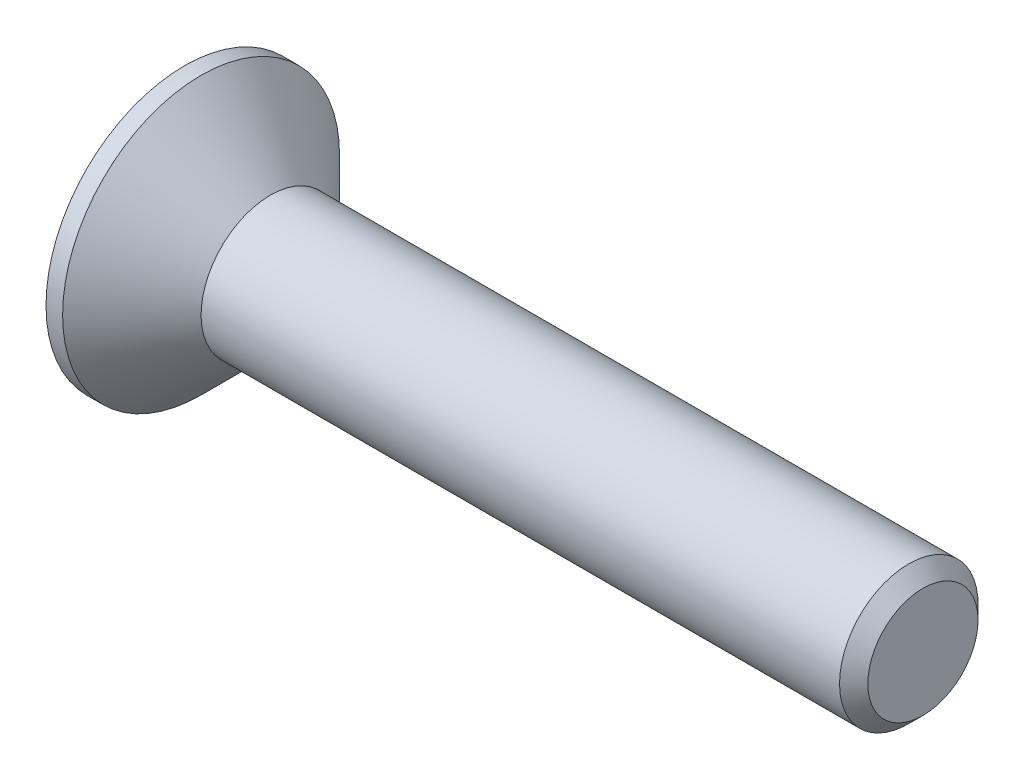
ISO-10303-21;
HEADER;
FILE_DESCRIPTION(('STEP AP214'),'2;1');
FILE_NAME('part.step','',(''),(''),'','','');
FILE_SCHEMA(('AUTOMOTIVE_DESIGN { 1 0 10303 214 1 1 1 1 }'));
ENDSEC;
DATA;
#1=APPLICATION_CONTEXT('core data for automotive mechanical design processes');
#2=APPLICATION_PROTOCOL_DEFINITION('international standard','automotive_design',2000,#1);
#3=PRODUCT_CONTEXT('',#1,'mechanical');
#4=PRODUCT('Part','Part','',(#3));
#5=PRODUCT_RELATED_PRODUCT_CATEGORY('part','',(#4));
#6=PRODUCT_DEFINITION_FORMATION('','',#4);
#7=PRODUCT_DEFINITION_CONTEXT('part definition',#1,'design');
#8=PRODUCT_DEFINITION('design','',#6,#7);
#9=PRODUCT_DEFINITION_SHAPE('','',#8);
#10=(LENGTH_UNIT() NAMED_UNIT(*) SI_UNIT(.MILLI.,.METRE.));
#11=(NAMED_UNIT(*) PLANE_ANGLE_UNIT() SI_UNIT($,.RADIAN.));
#12=(NAMED_UNIT(*) SI_UNIT($,.STERADIAN.) SOLID_ANGLE_UNIT());
#13=UNCERTAINTY_MEASURE_WITH_UNIT(LENGTH_MEASURE(1.E-05),#10,'distance_accuracy_value','');
#14=(GEOMETRIC_REPRESENTATION_CONTEXT(3) GLOBAL_UNCERTAINTY_ASSIGNED_CONTEXT((#13)) GLOBAL_UNIT_ASSIGNED_CONTEXT((#10,
#11,#12)) REPRESENTATION_CONTEXT('',''));
#15=CARTESIAN_POINT('',(0.,0.,0.));
#16=DIRECTION('',(0.,0.,1.));
#17=DIRECTION('',(1.,0.,0.));
#18=AXIS2_PLACEMENT_3D('',#15,#16,#17);
#19=CARTESIAN_POINT('',(1.04599999917809,0.,0.));
#20=DIRECTION('',(-1.,0.,0.));
#21=DIRECTION('',(0.,0.,1.));
#22=AXIS2_PLACEMENT_3D('',#19,#20,#21);
#23=CONICAL_SURFACE('',#22,1.16162874121528,1.04719754989847);
#24=CARTESIAN_POINT('',(1.71666666756209,-1.13686837721616E-10,0.));
#25=VERTEX_POINT('',#24);
#26=VERTEX_LOOP('',#25);
#27=FACE_BOUND('',#26,.T.);
#28=CARTESIAN_POINT('',(1.04999999915816,0.99999999988541,-0.577350269477191));
#29=CARTESIAN_POINT('',(1.06465222655813,0.956056056027435,-0.602721317150959));
#30=CARTESIAN_POINT('',(1.07797766057508,0.911732788715829,-0.628311367406472));
#31=CARTESIAN_POINT('',(1.10123680546114,0.822318826403541,-0.679934542574106));
#32=CARTESIAN_POINT('',(1.11116228902451,0.777226543207014,-0.705968584431704));
#33=CARTESIAN_POINT('',(1.1266120197586,0.687600782865967,-0.757714041302104));
#34=CARTESIAN_POINT('',(1.13223910544002,0.643081091930934,-0.783417496843638));
#35=CARTESIAN_POINT('',(1.1389554151745,0.553832339498311,-0.834945288082512));
#36=CARTESIAN_POINT('',(1.14005020224715,0.509103602173087,-0.860769436618843));
#37=CARTESIAN_POINT('',(1.13776685413357,0.42553275490695,-0.909019087785041));
#38=CARTESIAN_POINT('',(1.13494935659067,0.386678104479406,-0.931451830668418));
#39=CARTESIAN_POINT('',(1.12602134881308,0.309221928999102,-0.976171174432198));
#40=CARTESIAN_POINT('',(1.1199077917733,0.270620671646619,-0.998457620755773));
#41=CARTESIAN_POINT('',(1.10462508245671,0.193004929140783,-1.04326909058492));
#42=CARTESIAN_POINT('',(1.09539117799923,0.154000262351649,-1.06578844545527));
#43=CARTESIAN_POINT('',(1.07443411865222,0.0765725151241327,-1.11049137615979));
#44=CARTESIAN_POINT('',(1.06271588467684,0.0381484435119863,-1.13267552424842));
#45=CARTESIAN_POINT('',(1.04999999903347,2.13019461317065E-10,-1.15470053825626));
#46=B_SPLINE_CURVE_WITH_KNOTS('',3,(#28,#29,#30,#31,#32,#33,#34,#35,#36,#37,#38,#39,#40,#41,#42,
#43,#44,#45),.UNSPECIFIED.,.F.,.F.,(4,2,2,2,2,2,2,2,4),(0.,0.158508005804988,0.31739690857287,
0.472353803151371,0.62712044453655,0.76185389126852,0.896712096716049,1.03456081093649,
1.17213898632063),.UNSPECIFIED.);
#47=CARTESIAN_POINT('',(1.04999999900237,1.,-0.577350269051391));
#48=VERTEX_POINT('',#47);
#49=CARTESIAN_POINT('',(1.04999999904228,0.,-1.15470053824102));
#50=VERTEX_POINT('',#49);
#51=EDGE_CURVE('E81',#48,#50,#46,.T.);
#52=ORIENTED_EDGE('',*,*,#51,.T.);
#53=CARTESIAN_POINT('',(1.04999999915816,-3.06333742717169E-10,-1.1547005384238));
#54=CARTESIAN_POINT('',(1.06465222655813,-0.0439439440414311,-1.1293294905372));
#55=CARTESIAN_POINT('',(1.07797766057508,-0.0882672113026287,-1.10373944019437));
#56=CARTESIAN_POINT('',(1.10123680546114,-0.177681173577958,-1.05211626496273));
#57=CARTESIAN_POINT('',(1.11116228902451,-0.222773456788089,-1.02608222312869));
#58=CARTESIAN_POINT('',(1.1266120197586,-0.31239921713881,-0.974336766275047));
#59=CARTESIAN_POINT('',(1.13223910544002,-0.35691890807034,-0.948633310727445));
#60=CARTESIAN_POINT('',(1.1389554151745,-0.446167660500418,-0.897105519484162));
#61=CARTESIAN_POINT('',(1.14005020224715,-0.490896397826595,-0.871281370949482));
#62=CARTESIAN_POINT('',(1.13776685413357,-0.574467245093328,-0.823031719784317));
#63=CARTESIAN_POINT('',(1.13494935659067,-0.61332189552067,-0.800598976900589));
#64=CARTESIAN_POINT('',(1.12602134881307,-0.690778071000823,-0.75587963313655));
#65=CARTESIAN_POINT('',(1.1199077917733,-0.72937932835336,-0.733593186813067));
#66=CARTESIAN_POINT('',(1.10462508245671,-0.806995070859239,-0.688781716983995));
#67=CARTESIAN_POINT('',(1.09539117799923,-0.845999737648361,-0.666262362113631));
#68=CARTESIAN_POINT('',(1.07443411865221,-0.923427484875856,-0.621559431409065));
#69=CARTESIAN_POINT('',(1.06271588467684,-0.961851556487991,-0.599375283320425));
#70=CARTESIAN_POINT('',(1.04999999903347,-0.99999999978698,-0.577350269312614));
#71=B_SPLINE_CURVE_WITH_KNOTS('',3,(#53,#54,#55,#56,#57,#58,#59,#60,#61,#62,#63,#64,#65,#66,#67,
#68,#69,#70),.UNSPECIFIED.,.F.,.F.,(4,2,2,2,2,2,2,2,4),(0.,0.158508005804988,0.31739690857287,
0.472353803151372,0.627120444536551,0.76185389126852,0.896712096716049,1.03456081093649,
1.17213898632063),.UNSPECIFIED.);
#72=CARTESIAN_POINT('',(1.04999999904228,-0.999999999880284,-0.577350269120509));
#73=VERTEX_POINT('',#72);
#74=EDGE_CURVE('E83',#50,#73,#71,.T.);
#75=ORIENTED_EDGE('',*,*,#74,.T.);
#76=CARTESIAN_POINT('',(1.04999999915816,-1.00000000019174,-0.577350268946607));
#77=CARTESIAN_POINT('',(1.06465222655813,-1.00000000006887,-0.526608173386239));
#78=CARTESIAN_POINT('',(1.07797766057508,-1.00000000001846,-0.475428072787903));
#79=CARTESIAN_POINT('',(1.10123680546114,-0.999999999981499,-0.37218172238862));
#80=CARTESIAN_POINT('',(1.11116228902451,-0.999999999995102,-0.320113638696986));
#81=CARTESIAN_POINT('',(1.1266120197586,-1.00000000000478,-0.216622724972944));
#82=CARTESIAN_POINT('',(1.13223910544002,-1.00000000000127,-0.165215813883806));
#83=CARTESIAN_POINT('',(1.1389554151745,-0.999999999998728,-0.0621602314016498));
#84=CARTESIAN_POINT('',(1.14005020224715,-0.999999999999681,-0.0105119343306385));
#85=CARTESIAN_POINT('',(1.13776685413357,-1.00000000000028,0.085987368000724));
#86=CARTESIAN_POINT('',(1.13494935659067,-1.00000000000007,0.13085285376783));
#87=CARTESIAN_POINT('',(1.12602134881308,-0.999999999999925,0.220291541295648));
#88=CARTESIAN_POINT('',(1.1199077917733,-0.999999999999978,0.264864433942707));
#89=CARTESIAN_POINT('',(1.10462508245671,-1.00000000000002,0.354487373600926));
#90=CARTESIAN_POINT('',(1.09539117799923,-1.00000000000001,0.399526083341636));
#91=CARTESIAN_POINT('',(1.07443411865221,-0.999999999999989,0.488931944750729));
#92=CARTESIAN_POINT('',(1.06271588467684,-0.999999999999978,0.533300240927991));
#93=CARTESIAN_POINT('',(1.04999999903347,-1.,0.577350268943651));
#94=B_SPLINE_CURVE_WITH_KNOTS('',3,(#76,#77,#78,#79,#80,#81,#82,#83,#84,#85,#86,#87,#88,#89,#90,
#91,#92,#93),.UNSPECIFIED.,.F.,.F.,(4,2,2,2,2,2,2,2,4),(0.,0.158508005804988,0.31739690857287,
0.472353803151372,0.627120444536551,0.761853891268521,0.89671209671605,1.03456081093649,
1.17213898632064),.UNSPECIFIED.);
#95=CARTESIAN_POINT('',(1.04999999904228,-0.999999999880285,0.577350269120508));
#96=VERTEX_POINT('',#95);
#97=EDGE_CURVE('E104',#73,#96,#94,.T.);
#98=ORIENTED_EDGE('',*,*,#97,.T.);
#99=CARTESIAN_POINT('',(1.04999999915816,-0.999999999885411,0.57735026947719));
#100=CARTESIAN_POINT('',(1.06465222655813,-0.956056056027436,0.602721317150959));
#101=CARTESIAN_POINT('',(1.07797766057508,-0.91173278871583,0.628311367406472));
#102=CARTESIAN_POINT('',(1.10123680546114,-0.822318826403542,0.679934542574106));
#103=CARTESIAN_POINT('',(1.11116228902451,-0.777226543207014,0.705968584431704));
#104=CARTESIAN_POINT('',(1.1266120197586,-0.687600782865967,0.757714041302104));
#105=CARTESIAN_POINT('',(1.13223910544002,-0.643081091930935,0.783417496843638));
#106=CARTESIAN_POINT('',(1.1389554151745,-0.553832339498312,0.834945288082513));
#107=CARTESIAN_POINT('',(1.14005020224715,-0.509103602173087,0.860769436618843));
#108=CARTESIAN_POINT('',(1.13776685413357,-0.42553275490695,0.909019087785041));
#109=CARTESIAN_POINT('',(1.13494935659067,-0.386678104479406,0.931451830668419));
#110=CARTESIAN_POINT('',(1.12602134881308,-0.309221928999103,0.976171174432198));
#111=CARTESIAN_POINT('',(1.1199077917733,-0.270620671646619,0.998457620755774));
#112=CARTESIAN_POINT('',(1.10462508245671,-0.193004929140783,1.04326909058492));
#113=CARTESIAN_POINT('',(1.09539117799923,-0.15400026235165,1.06578844545527));
#114=CARTESIAN_POINT('',(1.07443411865222,-0.0765725151241331,1.11049137615979));
#115=CARTESIAN_POINT('',(1.06271588467684,-0.0381484435119867,1.13267552424842));
#116=CARTESIAN_POINT('',(1.04999999903347,-2.13019774962938E-10,1.15470053825626));
#117=B_SPLINE_CURVE_WITH_KNOTS('',3,(#99,#100,#101,#102,#103,#104,#105,#106,#107,#108,#109,#110,
#111,#112,#113,#114,#115,#116),.UNSPECIFIED.,.F.,.F.,(4,2,2,2,2,2,2,2,4),(0.,0.158508005804988,
0.317396908572871,0.472353803151372,0.627120444536551,0.761853891268521,0.89671209671605,
1.03456081093649,1.17213898632064),.UNSPECIFIED.);
#118=CARTESIAN_POINT('',(1.04999999904228,0.,1.15470053824102));
#119=VERTEX_POINT('',#118);
#120=EDGE_CURVE('E109',#96,#119,#117,.T.);
#121=ORIENTED_EDGE('',*,*,#120,.T.);
#122=CARTESIAN_POINT('',(1.04999999915816,3.06333275139649E-10,1.1547005384238));
#123=CARTESIAN_POINT('',(1.06465222655813,0.0439439440414307,1.1293294905372));
#124=CARTESIAN_POINT('',(1.07797766057508,0.0882672113026281,1.10373944019437));
#125=CARTESIAN_POINT('',(1.10123680546114,0.177681173577957,1.05211626496273));
#126=CARTESIAN_POINT('',(1.11116228902451,0.222773456788088,1.02608222312869));
#127=CARTESIAN_POINT('',(1.1266120197586,0.31239921713881,0.974336766275047));
#128=CARTESIAN_POINT('',(1.13223910544002,0.356918908070339,0.948633310727444));
#129=CARTESIAN_POINT('',(1.1389554151745,0.446167660500417,0.897105519484162));
#130=CARTESIAN_POINT('',(1.14005020224715,0.490896397826594,0.871281370949481));
#131=CARTESIAN_POINT('',(1.13776685413357,0.574467245093327,0.823031719784317));
#132=CARTESIAN_POINT('',(1.13494935659067,0.613321895520669,0.800598976900588));
#133=CARTESIAN_POINT('',(1.12602134881308,0.690778071000823,0.755879633136549));
#134=CARTESIAN_POINT('',(1.1199077917733,0.729379328353359,0.733593186813066));
#135=CARTESIAN_POINT('',(1.10462508245671,0.806995070859239,0.688781716983994));
#136=CARTESIAN_POINT('',(1.09539117799923,0.845999737648361,0.666262362113629));
#137=CARTESIAN_POINT('',(1.07443411865222,0.923427484875856,0.621559431409063));
#138=CARTESIAN_POINT('',(1.06271588467684,0.961851556487991,0.599375283320423));
#139=CARTESIAN_POINT('',(1.04999999903347,0.99999999978698,0.577350269312612));
#140=B_SPLINE_CURVE_WITH_KNOTS('',3,(#122,#123,#124,#125,#126,#127,#128,#129,#130,#131,#132,
#133,#134,#135,#136,#137,#138,#139),.UNSPECIFIED.,.F.,.F.,(4,2,2,2,2,2,2,2,4),(0.,
0.158508005804988,0.31739690857287,0.472353803151372,0.627120444536551,0.761853891268521,
0.89671209671605,1.03456081093649,1.17213898632064),.UNSPECIFIED.);
#141=CARTESIAN_POINT('',(1.04999999904228,0.999999999880285,0.577350269120507));
#142=VERTEX_POINT('',#141);
#143=EDGE_CURVE('E114',#119,#142,#140,.T.);
#144=ORIENTED_EDGE('',*,*,#143,.T.);
#145=CARTESIAN_POINT('',(1.04999999915816,1.00000000019174,0.577350268946605));
#146=CARTESIAN_POINT('',(1.06465222655813,1.00000000006887,0.526608173386237));
#147=CARTESIAN_POINT('',(1.07797766057508,1.00000000001846,0.475428072787902));
#148=CARTESIAN_POINT('',(1.10123680546114,0.999999999981499,0.372181722388619));
#149=CARTESIAN_POINT('',(1.11116228902451,0.999999999995102,0.320113638696985));
#150=CARTESIAN_POINT('',(1.1266120197586,1.00000000000478,0.216622724972943));
#151=CARTESIAN_POINT('',(1.13223910544002,1.00000000000127,0.165215813883805));
#152=CARTESIAN_POINT('',(1.1389554151745,0.999999999998728,0.0621602314016488));
#153=CARTESIAN_POINT('',(1.14005020224715,0.999999999999681,0.0105119343306376));
#154=CARTESIAN_POINT('',(1.13776685413357,1.00000000000028,-0.0859873680007249));
#155=CARTESIAN_POINT('',(1.13494935659067,1.00000000000007,-0.130852853767831));
#156=CARTESIAN_POINT('',(1.12602134881308,0.999999999999925,-0.220291541295649));
#157=CARTESIAN_POINT('',(1.1199077917733,0.999999999999978,-0.264864433942708));
#158=CARTESIAN_POINT('',(1.10462508245671,1.00000000000002,-0.354487373600927));
#159=CARTESIAN_POINT('',(1.09539117799923,1.00000000000001,-0.399526083341637));
#160=CARTESIAN_POINT('',(1.07443411865221,0.999999999999989,-0.48893194475073));
#161=CARTESIAN_POINT('',(1.06271588467684,0.999999999999978,-0.533300240927992));
#162=CARTESIAN_POINT('',(1.04999999903347,1.,-0.577350268943652));
#163=B_SPLINE_CURVE_WITH_KNOTS('',3,(#145,#146,#147,#148,#149,#150,#151,#152,#153,#154,#155,
#156,#157,#158,#159,#160,#161,#162),.UNSPECIFIED.,.F.,.F.,(4,2,2,2,2,2,2,2,4),(0.,
0.158508005804988,0.31739690857287,0.472353803151372,0.62712044453655,0.76185389126852,
0.89671209671605,1.03456081093649,1.17213898632063),.UNSPECIFIED.);
#164=EDGE_CURVE('E21',#142,#48,#163,.T.);
#165=ORIENTED_EDGE('',*,*,#164,.T.);
#166=EDGE_LOOP('',(#52,#75,#98,#121,#144,#165));
#167=FACE_BOUND('',#166,.T.);
#168=ADVANCED_FACE('F17',(#27,#167),#23,.F.);
#169=CARTESIAN_POINT('',(0.,1.,0.577350269189625));
#170=DIRECTION('',(0.,1.,0.));
#171=DIRECTION('',(0.,0.,1.));
#172=AXIS2_PLACEMENT_3D('',#169,#170,#171);
#173=PLANE('',#172);
#174=DIRECTION('',(1.,0.,0.));
#175=VECTOR('',#174,1.);
#176=CARTESIAN_POINT('',(0.,1.,0.577350269189625));
#177=LINE('',#176,#175);
#178=CARTESIAN_POINT('',(0.,0.999999999999999,0.577350269189625));
#179=VERTEX_POINT('',#178);
#180=EDGE_CURVE('E117',#142,#179,#177,.F.);
#181=ORIENTED_EDGE('',*,*,#180,.T.);
#182=DIRECTION('',(0.,0.,1.));
#183=VECTOR('',#182,1.);
#184=CARTESIAN_POINT('',(0.,0.999999999999999,0.));
#185=LINE('',#184,#183);
#186=CARTESIAN_POINT('',(0.,0.999999999999999,-0.577350269189626));
#187=VERTEX_POINT('',#186);
#188=EDGE_CURVE('E87',#187,#179,#185,.T.);
#189=ORIENTED_EDGE('',*,*,#188,.F.);
#190=DIRECTION('',(1.,0.,0.));
#191=VECTOR('',#190,1.);
#192=CARTESIAN_POINT('',(0.,0.999999999999999,-0.577350269189626));
#193=LINE('',#192,#191);
#194=EDGE_CURVE('E88',#187,#48,#193,.T.);
#195=ORIENTED_EDGE('',*,*,#194,.T.);
#196=ORIENTED_EDGE('',*,*,#164,.F.);
#197=EDGE_LOOP('',(#181,#189,#195,#196));
#198=FACE_BOUND('',#197,.T.);
#199=ADVANCED_FACE('F77',(#198),#173,.F.);
#200=CARTESIAN_POINT('',(0.,0.,1.15470053837925));
#201=DIRECTION('',(0.,0.500000000000001,0.866025403784438));
#202=DIRECTION('',(0.,-0.866025403784438,0.500000000000001));
#203=AXIS2_PLACEMENT_3D('',#200,#201,#202);
#204=PLANE('',#203);
#205=DIRECTION('',(1.,0.,0.));
#206=VECTOR('',#205,1.);
#207=CARTESIAN_POINT('',(0.,0.,1.15470053837925));
#208=LINE('',#207,#206);
#209=CARTESIAN_POINT('',(0.,0.,1.15470053837925));
#210=VERTEX_POINT('',#209);
#211=EDGE_CURVE('E112',#119,#210,#208,.F.);
#212=ORIENTED_EDGE('',*,*,#211,.T.);
#213=DIRECTION('',(0.,-0.866025403784438,0.500000000000001));
#214=VECTOR('',#213,1.);
#215=CARTESIAN_POINT('',(0.,1.,0.577350269189625));
#216=LINE('',#215,#214);
#217=EDGE_CURVE('E123',#179,#210,#216,.T.);
#218=ORIENTED_EDGE('',*,*,#217,.F.);
#219=ORIENTED_EDGE('',*,*,#180,.F.);
#220=ORIENTED_EDGE('',*,*,#143,.F.);
#221=EDGE_LOOP('',(#212,#218,#219,#220));
#222=FACE_BOUND('',#221,.T.);
#223=ADVANCED_FACE('F190',(#222),#204,.F.);
#224=CARTESIAN_POINT('',(0.,-1.,0.577350269189626));
#225=DIRECTION('',(0.,-0.5,0.866025403784439));
#226=DIRECTION('',(0.,-0.866025403784439,-0.5));
#227=AXIS2_PLACEMENT_3D('',#224,#225,#226);
#228=PLANE('',#227);
#229=DIRECTION('',(1.,0.,0.));
#230=VECTOR('',#229,1.);
#231=CARTESIAN_POINT('',(0.,-1.,0.577350269189625));
#232=LINE('',#231,#230);
#233=CARTESIAN_POINT('',(0.,-1.,0.577350269189625));
#234=VERTEX_POINT('',#233);
#235=EDGE_CURVE('E107',#96,#234,#232,.F.);
#236=ORIENTED_EDGE('',*,*,#235,.T.);
#237=DIRECTION('',(0.,-0.866025403784439,-0.5));
#238=VECTOR('',#237,1.);
#239=CARTESIAN_POINT('',(0.,0.,1.15470053837925));
#240=LINE('',#239,#238);
#241=EDGE_CURVE('E137',#210,#234,#240,.T.);
#242=ORIENTED_EDGE('',*,*,#241,.F.);
#243=ORIENTED_EDGE('',*,*,#211,.F.);
#244=ORIENTED_EDGE('',*,*,#120,.F.);
#245=EDGE_LOOP('',(#236,#242,#243,#244));
#246=FACE_BOUND('',#245,.T.);
#247=ADVANCED_FACE('F175',(#246),#228,.F.);
#248=CARTESIAN_POINT('',(0.,-1.,-0.577350269189626));
#249=DIRECTION('',(0.,-1.,0.));
#250=DIRECTION('',(0.,0.,-1.));
#251=AXIS2_PLACEMENT_3D('',#248,#249,#250);
#252=PLANE('',#251);
#253=DIRECTION('',(1.,0.,0.));
#254=VECTOR('',#253,1.);
#255=CARTESIAN_POINT('',(0.,-1.,-0.577350269189627));
#256=LINE('',#255,#254);
#257=CARTESIAN_POINT('',(0.,-1.,-0.577350269189626));
#258=VERTEX_POINT('',#257);
#259=EDGE_CURVE('E96',#73,#258,#256,.F.);
#260=ORIENTED_EDGE('',*,*,#259,.T.);
#261=DIRECTION('',(0.,0.,1.));
#262=VECTOR('',#261,1.);
#263=CARTESIAN_POINT('',(0.,-1.,0.));
#264=LINE('',#263,#262);
#265=EDGE_CURVE('E132',#234,#258,#264,.F.);
#266=ORIENTED_EDGE('',*,*,#265,.F.);
#267=ORIENTED_EDGE('',*,*,#235,.F.);
#268=ORIENTED_EDGE('',*,*,#97,.F.);
#269=EDGE_LOOP('',(#260,#266,#267,#268));
#270=FACE_BOUND('',#269,.T.);
#271=ADVANCED_FACE('F171',(#270),#252,.F.);
#272=CARTESIAN_POINT('',(0.,0.,-1.15470053837925));
#273=DIRECTION('',(0.,-0.5,-0.866025403784439));
#274=DIRECTION('',(0.,0.866025403784439,-0.5));
#275=AXIS2_PLACEMENT_3D('',#272,#273,#274);
#276=PLANE('',#275);
#277=DIRECTION('',(1.,0.,0.));
#278=VECTOR('',#277,1.);
#279=CARTESIAN_POINT('',(0.,0.,-1.15470053837925));
#280=LINE('',#279,#278);
#281=CARTESIAN_POINT('',(0.,0.,-1.15470053837925));
#282=VERTEX_POINT('',#281);
#283=EDGE_CURVE('E39',#50,#282,#280,.F.);
#284=ORIENTED_EDGE('',*,*,#283,.T.);
#285=DIRECTION('',(0.,0.866025403784439,-0.5));
#286=VECTOR('',#285,1.);
#287=CARTESIAN_POINT('',(0.,-1.,-0.577350269189626));
#288=LINE('',#287,#286);
#289=EDGE_CURVE('E128',#258,#282,#288,.T.);
#290=ORIENTED_EDGE('',*,*,#289,.F.);
#291=ORIENTED_EDGE('',*,*,#259,.F.);
#292=ORIENTED_EDGE('',*,*,#74,.F.);
#293=EDGE_LOOP('',(#284,#290,#291,#292));
#294=FACE_BOUND('',#293,.T.);
#295=ADVANCED_FACE('F166',(#294),#276,.F.);
#296=CARTESIAN_POINT('',(0.,0.999999999999999,-0.577350269189626));
#297=DIRECTION('',(0.,0.5,-0.866025403784439));
#298=DIRECTION('',(0.,0.866025403784439,0.5));
#299=AXIS2_PLACEMENT_3D('',#296,#297,#298);
#300=PLANE('',#299);
#301=ORIENTED_EDGE('',*,*,#194,.F.);
#302=DIRECTION('',(0.,0.866025403784438,0.500000000000001));
#303=VECTOR('',#302,1.);
#304=CARTESIAN_POINT('',(0.,0.,-1.15470053837925));
#305=LINE('',#304,#303);
#306=EDGE_CURVE('E92',#282,#187,#305,.T.);
#307=ORIENTED_EDGE('',*,*,#306,.F.);
#308=ORIENTED_EDGE('',*,*,#283,.F.);
#309=ORIENTED_EDGE('',*,*,#51,.F.);
#310=EDGE_LOOP('',(#301,#307,#308,#309));
#311=FACE_BOUND('',#310,.T.);
#312=ADVANCED_FACE('F90',(#311),#300,.F.);
#313=CARTESIAN_POINT('',(0.,2.07735026918963,0.));
#314=DIRECTION('',(-1.,0.,0.));
#315=DIRECTION('',(0.,0.,1.));
#316=AXIS2_PLACEMENT_3D('',#313,#314,#315);
#317=PLANE('',#316);
#318=ORIENTED_EDGE('',*,*,#289,.T.);
#319=ORIENTED_EDGE('',*,*,#306,.T.);
#320=ORIENTED_EDGE('',*,*,#188,.T.);
#321=ORIENTED_EDGE('',*,*,#217,.T.);
#322=ORIENTED_EDGE('',*,*,#241,.T.);
#323=ORIENTED_EDGE('',*,*,#265,.T.);
#324=EDGE_LOOP('',(#318,#319,#320,#321,#322,#323));
#325=FACE_BOUND('',#324,.T.);
#326=CARTESIAN_POINT('',(0.,0.,0.));
#327=DIRECTION('',(1.,0.,0.));
#328=DIRECTION('',(0.,1.,0.));
#329=AXIS2_PLACEMENT_3D('',#326,#327,#328);
#330=CIRCLE('',#329,3.00000000000001);
#331=CARTESIAN_POINT('',(0.,3.00000000000001,0.));
#332=VERTEX_POINT('',#331);
#333=EDGE_CURVE('E127',#332,#332,#330,.T.);
#334=ORIENTED_EDGE('',*,*,#333,.F.);
#335=EDGE_LOOP('',(#334));
#336=FACE_BOUND('',#335,.T.);
#337=ADVANCED_FACE('F165',(#325,#336),#317,.T.);
#338=CARTESIAN_POINT('',(0.179999999999987,0.,0.));
#339=DIRECTION('',(1.,0.,0.));
#340=DIRECTION('',(0.,1.,0.));
#341=AXIS2_PLACEMENT_3D('',#338,#339,#340);
#342=CYLINDRICAL_SURFACE('',#341,3.00000000000001);
#343=ORIENTED_EDGE('',*,*,#333,.T.);
#344=EDGE_LOOP('',(#343));
#345=FACE_BOUND('',#344,.T.);
#346=CARTESIAN_POINT('',(0.359999999318461,0.,0.));
#347=DIRECTION('',(-1.,0.,0.));
#348=DIRECTION('',(0.,1.,0.));
#349=AXIS2_PLACEMENT_3D('',#346,#347,#348);
#350=CIRCLE('',#349,2.99999999930378);
#351=CARTESIAN_POINT('',(0.359999999318461,2.99999999930378,0.));
#352=VERTEX_POINT('',#351);
#353=EDGE_CURVE('E151',#352,#352,#350,.F.);
#354=ORIENTED_EDGE('',*,*,#353,.F.);
#355=EDGE_LOOP('',(#354));
#356=FACE_BOUND('',#355,.T.);
#357=ADVANCED_FACE('F217',(#345,#356),#342,.T.);
#358=CARTESIAN_POINT('',(16.,0.749999999999996,0.));
#359=DIRECTION('',(1.,0.,0.));
#360=DIRECTION('',(0.,0.,-1.));
#361=AXIS2_PLACEMENT_3D('',#358,#359,#360);
#362=PLANE('',#361);
#363=CARTESIAN_POINT('',(16.0000000001332,0.,0.));
#364=DIRECTION('',(-1.,0.,0.));
#365=DIRECTION('',(0.,0.,1.));
#366=AXIS2_PLACEMENT_3D('',#363,#364,#365);
#367=CIRCLE('',#366,1.19327500010513);
#368=CARTESIAN_POINT('',(16.0000000001332,0.,1.19327500010513));
#369=VERTEX_POINT('',#368);
#370=EDGE_CURVE('E148',#369,#369,#367,.T.);
#371=ORIENTED_EDGE('',*,*,#370,.F.);
#372=EDGE_LOOP('',(#371));
#373=FACE_BOUND('',#372,.T.);
#374=ADVANCED_FACE('F214',(#373),#362,.T.);
#375=CARTESIAN_POINT('',(0.359999999375304,0.,0.));
#376=DIRECTION('',(-1.,0.,0.));
#377=DIRECTION('',(0.,0.,1.));
#378=AXIS2_PLACEMENT_3D('',#375,#376,#377);
#379=CONICAL_SURFACE('',#378,2.99999999924694,0.785398162487954);
#380=ORIENTED_EDGE('',*,*,#353,.T.);
#381=EDGE_LOOP('',(#380));
#382=FACE_BOUND('',#381,.T.);
#383=CARTESIAN_POINT('',(1.85999999999999,0.,0.));
#384=DIRECTION('',(1.,0.,0.));
#385=DIRECTION('',(0.,1.,0.));
#386=AXIS2_PLACEMENT_3D('',#383,#384,#385);
#387=CIRCLE('',#386,1.49999999999999);
#388=CARTESIAN_POINT('',(1.85999999999999,1.49999999999999,0.));
#389=VERTEX_POINT('',#388);
#390=EDGE_CURVE('E30',#389,#389,#387,.T.);
#391=ORIENTED_EDGE('',*,*,#390,.F.);
#392=EDGE_LOOP('',(#391));
#393=FACE_BOUND('',#392,.T.);
#394=ADVANCED_FACE('F207',(#382,#393),#379,.T.);
#395=CARTESIAN_POINT('',(15.6932749997623,0.,0.));
#396=DIRECTION('',(-1.,0.,0.));
#397=DIRECTION('',(0.,0.,1.));
#398=AXIS2_PLACEMENT_3D('',#395,#396,#397);
#399=CONICAL_SURFACE('',#398,1.49999999985084,0.785398162378168);
#400=ORIENTED_EDGE('',*,*,#370,.T.);
#401=EDGE_LOOP('',(#400));
#402=FACE_BOUND('',#401,.T.);
#403=CARTESIAN_POINT('',(15.693275,0.,0.));
#404=DIRECTION('',(1.,0.,0.));
#405=DIRECTION('',(0.,1.,0.));
#406=AXIS2_PLACEMENT_3D('',#403,#404,#405);
#407=CIRCLE('',#406,1.49999999999999);
#408=CARTESIAN_POINT('',(15.693275,1.49999999999999,0.));
#409=VERTEX_POINT('',#408);
#410=EDGE_CURVE('E11',#409,#409,#407,.F.);
#411=ORIENTED_EDGE('',*,*,#410,.F.);
#412=EDGE_LOOP('',(#411));
#413=FACE_BOUND('',#412,.T.);
#414=ADVANCED_FACE('F201',(#402,#413),#399,.T.);
#415=CARTESIAN_POINT('',(9.7,0.,0.));
#416=DIRECTION('',(1.,0.,0.));
#417=DIRECTION('',(0.,1.,0.));
#418=AXIS2_PLACEMENT_3D('',#415,#416,#417);
#419=CYLINDRICAL_SURFACE('',#418,1.49999999999999);
#420=ORIENTED_EDGE('',*,*,#410,.T.);
#421=EDGE_LOOP('',(#420));
#422=FACE_BOUND('',#421,.T.);
#423=ORIENTED_EDGE('',*,*,#390,.T.);
#424=EDGE_LOOP('',(#423));
#425=FACE_BOUND('',#424,.T.);
#426=ADVANCED_FACE('F199',(#422,#425),#419,.T.);
#427=CLOSED_SHELL('',(#168,#199,#223,#247,#271,#295,#312,#337,#357,#374,#394,#414,#426));
#428=MANIFOLD_SOLID_BREP('B1',#427);
#429=ADVANCED_BREP_SHAPE_REPRESENTATION('',(#18,#428),#14);
#430=SHAPE_DEFINITION_REPRESENTATION(#9,#429);
ENDSEC;
END-ISO-10303-21;
